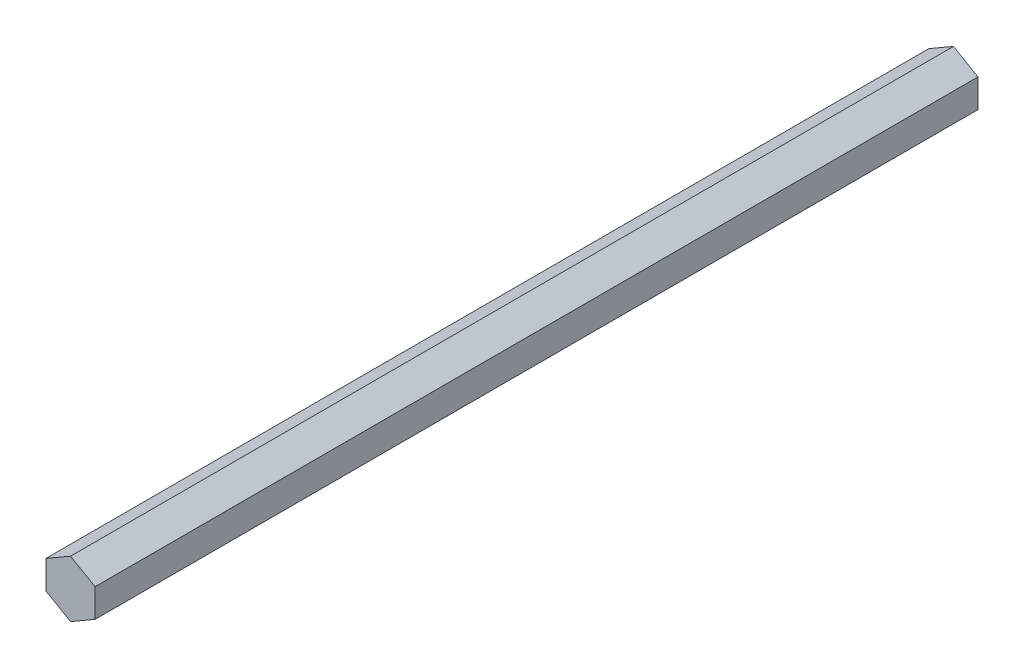
ISO-10303-21;
HEADER;
FILE_DESCRIPTION(('STEP AP214'),'2;1');
FILE_NAME('part.step','',(''),(''),'','','');
FILE_SCHEMA(('AUTOMOTIVE_DESIGN { 1 0 10303 214 1 1 1 1 }'));
ENDSEC;
DATA;
#1=APPLICATION_CONTEXT('core data for automotive mechanical design processes');
#2=APPLICATION_PROTOCOL_DEFINITION('international standard','automotive_design',2000,#1);
#3=PRODUCT_CONTEXT('',#1,'mechanical');
#4=PRODUCT('Part','Part','',(#3));
#5=PRODUCT_RELATED_PRODUCT_CATEGORY('part','',(#4));
#6=PRODUCT_DEFINITION_FORMATION('','',#4);
#7=PRODUCT_DEFINITION_CONTEXT('part definition',#1,'design');
#8=PRODUCT_DEFINITION('design','',#6,#7);
#9=PRODUCT_DEFINITION_SHAPE('','',#8);
#10=(LENGTH_UNIT() NAMED_UNIT(*) SI_UNIT(.MILLI.,.METRE.));
#11=(NAMED_UNIT(*) PLANE_ANGLE_UNIT() SI_UNIT($,.RADIAN.));
#12=(NAMED_UNIT(*) SI_UNIT($,.STERADIAN.) SOLID_ANGLE_UNIT());
#13=UNCERTAINTY_MEASURE_WITH_UNIT(LENGTH_MEASURE(1.E-05),#10,'distance_accuracy_value','');
#14=(GEOMETRIC_REPRESENTATION_CONTEXT(3) GLOBAL_UNCERTAINTY_ASSIGNED_CONTEXT((#13)) GLOBAL_UNIT_ASSIGNED_CONTEXT((#10,
#11,#12)) REPRESENTATION_CONTEXT('',''));
#15=CARTESIAN_POINT('',(0.,0.,0.));
#16=DIRECTION('',(0.,0.,1.));
#17=DIRECTION('',(1.,0.,0.));
#18=AXIS2_PLACEMENT_3D('',#15,#16,#17);
#19=CARTESIAN_POINT('',(3.17499999999998,5.49926131403123,228.6));
#20=DIRECTION('',(-0.499999999999995,-0.866025403784442,0.));
#21=DIRECTION('',(0.866025403784442,-0.499999999999995,0.));
#22=AXIS2_PLACEMENT_3D('',#19,#20,#21);
#23=PLANE('',#22);
#24=DIRECTION('',(-0.866025403784442,0.499999999999995,0.));
#25=VECTOR('',#24,1.);
#26=CARTESIAN_POINT('',(3.17499999999998,5.49926131403123,0.));
#27=LINE('',#26,#25);
#28=CARTESIAN_POINT('',(6.34999999999996,3.6661742093542,0.));
#29=VERTEX_POINT('',#28);
#30=CARTESIAN_POINT('',(0.,7.33234841870825,0.));
#31=VERTEX_POINT('',#30);
#32=EDGE_CURVE('E119',#29,#31,#27,.T.);
#33=ORIENTED_EDGE('',*,*,#32,.T.);
#34=DIRECTION('',(0.,0.,-1.));
#35=VECTOR('',#34,1.);
#36=CARTESIAN_POINT('',(0.,7.33234841870825,228.6));
#37=LINE('',#36,#35);
#38=CARTESIAN_POINT('',(0.,7.33234841870825,228.6));
#39=VERTEX_POINT('',#38);
#40=EDGE_CURVE('E11',#39,#31,#37,.T.);
#41=ORIENTED_EDGE('',*,*,#40,.F.);
#42=DIRECTION('',(-0.866025403784442,0.499999999999995,0.));
#43=VECTOR('',#42,1.);
#44=CARTESIAN_POINT('',(3.17499999999998,5.49926131403123,228.6));
#45=LINE('',#44,#43);
#46=CARTESIAN_POINT('',(6.34999999999996,3.6661742093542,228.6));
#47=VERTEX_POINT('',#46);
#48=EDGE_CURVE('E129',#47,#39,#45,.T.);
#49=ORIENTED_EDGE('',*,*,#48,.F.);
#50=DIRECTION('',(0.,0.,-1.));
#51=VECTOR('',#50,1.);
#52=CARTESIAN_POINT('',(6.34999999999996,3.6661742093542,228.6));
#53=LINE('',#52,#51);
#54=EDGE_CURVE('E115',#47,#29,#53,.T.);
#55=ORIENTED_EDGE('',*,*,#54,.T.);
#56=EDGE_LOOP('',(#33,#41,#49,#55));
#57=FACE_BOUND('',#56,.T.);
#58=ADVANCED_FACE('F35',(#57),#23,.F.);
#59=CARTESIAN_POINT('',(-3.17500000000001,5.49926131403118,228.6));
#60=DIRECTION('',(0.500000000000001,-0.866025403784438,0.));
#61=DIRECTION('',(0.866025403784438,0.500000000000001,0.));
#62=AXIS2_PLACEMENT_3D('',#59,#60,#61);
#63=PLANE('',#62);
#64=DIRECTION('',(-0.866025403784438,-0.500000000000001,0.));
#65=VECTOR('',#64,1.);
#66=CARTESIAN_POINT('',(-3.17500000000001,5.49926131403118,0.));
#67=LINE('',#66,#65);
#68=CARTESIAN_POINT('',(-6.35000000000001,3.66617420935411,0.));
#69=VERTEX_POINT('',#68);
#70=EDGE_CURVE('E122',#31,#69,#67,.T.);
#71=ORIENTED_EDGE('',*,*,#70,.T.);
#72=DIRECTION('',(0.,0.,-1.));
#73=VECTOR('',#72,1.);
#74=CARTESIAN_POINT('',(-6.35000000000001,3.66617420935411,228.6));
#75=LINE('',#74,#73);
#76=CARTESIAN_POINT('',(-6.35000000000001,3.66617420935411,228.6));
#77=VERTEX_POINT('',#76);
#78=EDGE_CURVE('E43',#77,#69,#75,.T.);
#79=ORIENTED_EDGE('',*,*,#78,.F.);
#80=DIRECTION('',(-0.866025403784438,-0.500000000000001,0.));
#81=VECTOR('',#80,1.);
#82=CARTESIAN_POINT('',(-3.17500000000001,5.49926131403118,228.6));
#83=LINE('',#82,#81);
#84=EDGE_CURVE('E88',#39,#77,#83,.T.);
#85=ORIENTED_EDGE('',*,*,#84,.F.);
#86=ORIENTED_EDGE('',*,*,#40,.T.);
#87=EDGE_LOOP('',(#71,#79,#85,#86));
#88=FACE_BOUND('',#87,.T.);
#89=ADVANCED_FACE('F153',(#88),#63,.F.);
#90=CARTESIAN_POINT('',(-6.35,0.,228.6));
#91=DIRECTION('',(1.,0.,0.));
#92=DIRECTION('',(0.,1.,0.));
#93=AXIS2_PLACEMENT_3D('',#90,#91,#92);
#94=PLANE('',#93);
#95=DIRECTION('',(0.,-1.,0.));
#96=VECTOR('',#95,1.);
#97=CARTESIAN_POINT('',(-6.35,0.,0.));
#98=LINE('',#97,#96);
#99=CARTESIAN_POINT('',(-6.34999999999999,-3.66617420935416,0.));
#100=VERTEX_POINT('',#99);
#101=EDGE_CURVE('E124',#69,#100,#98,.T.);
#102=ORIENTED_EDGE('',*,*,#101,.T.);
#103=DIRECTION('',(0.,0.,-1.));
#104=VECTOR('',#103,1.);
#105=CARTESIAN_POINT('',(-6.34999999999999,-3.66617420935416,228.6));
#106=LINE('',#105,#104);
#107=CARTESIAN_POINT('',(-6.34999999999999,-3.66617420935416,228.6));
#108=VERTEX_POINT('',#107);
#109=EDGE_CURVE('E110',#108,#100,#106,.T.);
#110=ORIENTED_EDGE('',*,*,#109,.F.);
#111=DIRECTION('',(0.,-1.,0.));
#112=VECTOR('',#111,1.);
#113=CARTESIAN_POINT('',(-6.35,0.,228.6));
#114=LINE('',#113,#112);
#115=EDGE_CURVE('E101',#77,#108,#114,.T.);
#116=ORIENTED_EDGE('',*,*,#115,.F.);
#117=ORIENTED_EDGE('',*,*,#78,.T.);
#118=EDGE_LOOP('',(#102,#110,#116,#117));
#119=FACE_BOUND('',#118,.T.);
#120=ADVANCED_FACE('F135',(#119),#94,.F.);
#121=CARTESIAN_POINT('',(-3.17499999999997,-5.49926131403121,228.6));
#122=DIRECTION('',(0.499999999999995,0.866025403784441,0.));
#123=DIRECTION('',(-0.866025403784442,0.499999999999995,0.));
#124=AXIS2_PLACEMENT_3D('',#121,#122,#123);
#125=PLANE('',#124);
#126=DIRECTION('',(0.866025403784442,-0.499999999999995,0.));
#127=VECTOR('',#126,1.);
#128=CARTESIAN_POINT('',(-3.17499999999997,-5.49926131403121,0.));
#129=LINE('',#128,#127);
#130=CARTESIAN_POINT('',(0.,-7.33234841870826,0.));
#131=VERTEX_POINT('',#130);
#132=EDGE_CURVE('E109',#100,#131,#129,.T.);
#133=ORIENTED_EDGE('',*,*,#132,.T.);
#134=DIRECTION('',(0.,0.,-1.));
#135=VECTOR('',#134,1.);
#136=CARTESIAN_POINT('',(0.,-7.33234841870826,228.6));
#137=LINE('',#136,#135);
#138=CARTESIAN_POINT('',(0.,-7.33234841870826,228.6));
#139=VERTEX_POINT('',#138);
#140=EDGE_CURVE('E106',#139,#131,#137,.T.);
#141=ORIENTED_EDGE('',*,*,#140,.F.);
#142=DIRECTION('',(0.866025403784442,-0.499999999999995,0.));
#143=VECTOR('',#142,1.);
#144=CARTESIAN_POINT('',(-3.17499999999997,-5.49926131403121,228.6));
#145=LINE('',#144,#143);
#146=EDGE_CURVE('E95',#108,#139,#145,.T.);
#147=ORIENTED_EDGE('',*,*,#146,.F.);
#148=ORIENTED_EDGE('',*,*,#109,.T.);
#149=EDGE_LOOP('',(#133,#141,#147,#148));
#150=FACE_BOUND('',#149,.T.);
#151=ADVANCED_FACE('F107',(#150),#125,.F.);
#152=CARTESIAN_POINT('',(3.17500000000005,-5.49926131403116,228.6));
#153=DIRECTION('',(-0.500000000000007,0.866025403784435,0.));
#154=DIRECTION('',(-0.866025403784435,-0.500000000000007,0.));
#155=AXIS2_PLACEMENT_3D('',#152,#153,#154);
#156=PLANE('',#155);
#157=DIRECTION('',(0.866025403784435,0.500000000000007,0.));
#158=VECTOR('',#157,1.);
#159=CARTESIAN_POINT('',(3.17500000000005,-5.49926131403116,0.));
#160=LINE('',#159,#158);
#161=CARTESIAN_POINT('',(6.35000000000004,-3.66617420935407,0.));
#162=VERTEX_POINT('',#161);
#163=EDGE_CURVE('E74',#131,#162,#160,.T.);
#164=ORIENTED_EDGE('',*,*,#163,.T.);
#165=DIRECTION('',(0.,0.,-1.));
#166=VECTOR('',#165,1.);
#167=CARTESIAN_POINT('',(6.35000000000004,-3.66617420935407,228.6));
#168=LINE('',#167,#166);
#169=CARTESIAN_POINT('',(6.35000000000004,-3.66617420935407,228.6));
#170=VERTEX_POINT('',#169);
#171=EDGE_CURVE('E111',#170,#162,#168,.T.);
#172=ORIENTED_EDGE('',*,*,#171,.F.);
#173=DIRECTION('',(0.866025403784435,0.500000000000007,0.));
#174=VECTOR('',#173,1.);
#175=CARTESIAN_POINT('',(3.17500000000005,-5.49926131403116,228.6));
#176=LINE('',#175,#174);
#177=EDGE_CURVE('E99',#139,#170,#176,.T.);
#178=ORIENTED_EDGE('',*,*,#177,.F.);
#179=ORIENTED_EDGE('',*,*,#140,.T.);
#180=EDGE_LOOP('',(#164,#172,#178,#179));
#181=FACE_BOUND('',#180,.T.);
#182=ADVANCED_FACE('F113',(#181),#156,.F.);
#183=CARTESIAN_POINT('',(6.35,0.,228.6));
#184=DIRECTION('',(-1.,0.,0.));
#185=DIRECTION('',(0.,-1.,0.));
#186=AXIS2_PLACEMENT_3D('',#183,#184,#185);
#187=PLANE('',#186);
#188=DIRECTION('',(0.,1.,0.));
#189=VECTOR('',#188,1.);
#190=CARTESIAN_POINT('',(6.35,0.,0.));
#191=LINE('',#190,#189);
#192=EDGE_CURVE('E80',#162,#29,#191,.T.);
#193=ORIENTED_EDGE('',*,*,#192,.T.);
#194=ORIENTED_EDGE('',*,*,#54,.F.);
#195=DIRECTION('',(0.,1.,0.));
#196=VECTOR('',#195,1.);
#197=CARTESIAN_POINT('',(6.35,0.,228.6));
#198=LINE('',#197,#196);
#199=EDGE_CURVE('E51',#170,#47,#198,.T.);
#200=ORIENTED_EDGE('',*,*,#199,.F.);
#201=ORIENTED_EDGE('',*,*,#171,.T.);
#202=EDGE_LOOP('',(#193,#194,#200,#201));
#203=FACE_BOUND('',#202,.T.);
#204=ADVANCED_FACE('F142',(#203),#187,.F.);
#205=CARTESIAN_POINT('',(0.,0.,228.6));
#206=DIRECTION('',(0.,0.,1.));
#207=DIRECTION('',(1.,0.,0.));
#208=AXIS2_PLACEMENT_3D('',#205,#206,#207);
#209=PLANE('',#208);
#210=ORIENTED_EDGE('',*,*,#48,.T.);
#211=ORIENTED_EDGE('',*,*,#84,.T.);
#212=ORIENTED_EDGE('',*,*,#115,.T.);
#213=ORIENTED_EDGE('',*,*,#146,.T.);
#214=ORIENTED_EDGE('',*,*,#177,.T.);
#215=ORIENTED_EDGE('',*,*,#199,.T.);
#216=EDGE_LOOP('',(#210,#211,#212,#213,#214,#215));
#217=FACE_BOUND('',#216,.T.);
#218=ADVANCED_FACE('F97',(#217),#209,.T.);
#219=CARTESIAN_POINT('',(0.,0.,0.));
#220=DIRECTION('',(0.,0.,1.));
#221=DIRECTION('',(1.,0.,0.));
#222=AXIS2_PLACEMENT_3D('',#219,#220,#221);
#223=PLANE('',#222);
#224=ORIENTED_EDGE('',*,*,#32,.F.);
#225=ORIENTED_EDGE('',*,*,#192,.F.);
#226=ORIENTED_EDGE('',*,*,#163,.F.);
#227=ORIENTED_EDGE('',*,*,#132,.F.);
#228=ORIENTED_EDGE('',*,*,#101,.F.);
#229=ORIENTED_EDGE('',*,*,#70,.F.);
#230=EDGE_LOOP('',(#224,#225,#226,#227,#228,#229));
#231=FACE_BOUND('',#230,.T.);
#232=ADVANCED_FACE('F138',(#231),#223,.F.);
#233=CLOSED_SHELL('',(#58,#89,#120,#151,#182,#204,#218,#232));
#234=MANIFOLD_SOLID_BREP('B2',#233);
#235=ADVANCED_BREP_SHAPE_REPRESENTATION('',(#18,#234),#14);
#236=SHAPE_DEFINITION_REPRESENTATION(#9,#235);
ENDSEC;
END-ISO-10303-21;
